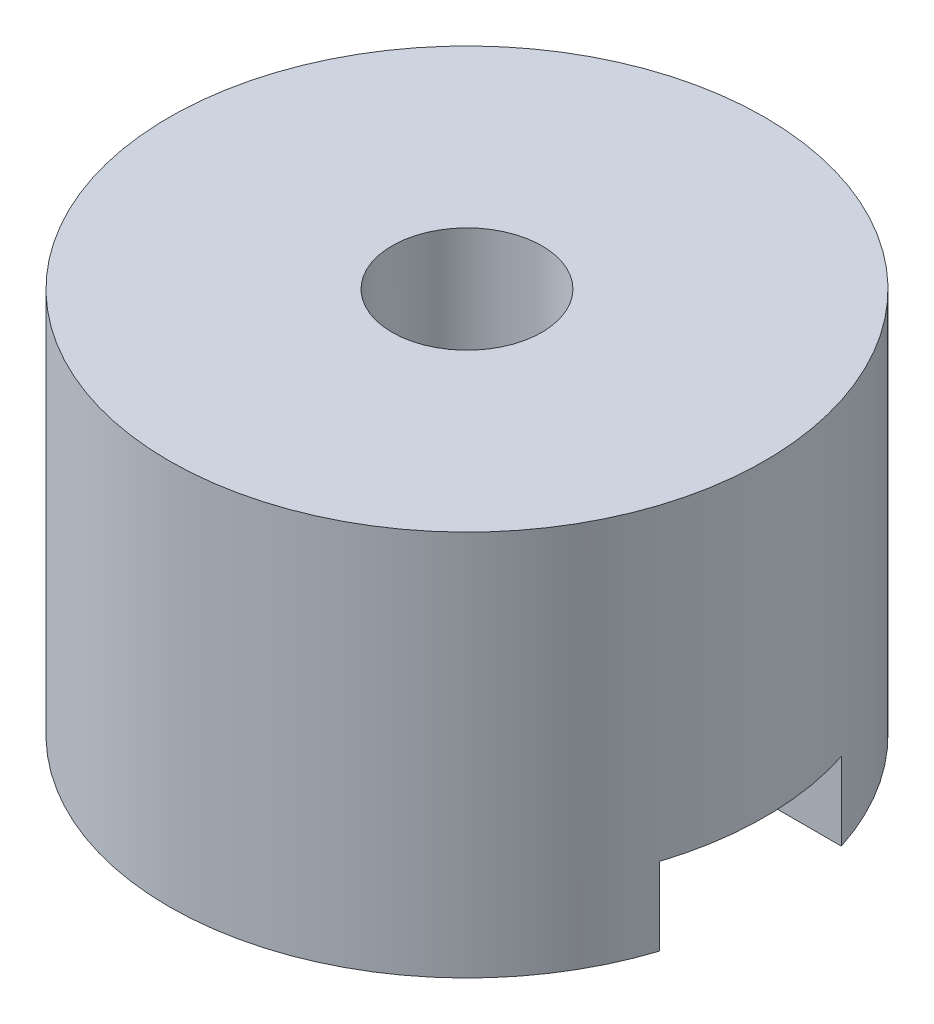
ISO-10303-21;
HEADER;
FILE_DESCRIPTION(('STEP AP214'),'2;1');
FILE_NAME('part.step','',(''),(''),'','','');
FILE_SCHEMA(('AUTOMOTIVE_DESIGN { 1 0 10303 214 1 1 1 1 }'));
ENDSEC;
DATA;
#1=APPLICATION_CONTEXT('core data for automotive mechanical design processes');
#2=APPLICATION_PROTOCOL_DEFINITION('international standard','automotive_design',2000,#1);
#3=PRODUCT_CONTEXT('',#1,'mechanical');
#4=PRODUCT('Part','Part','',(#3));
#5=PRODUCT_RELATED_PRODUCT_CATEGORY('part','',(#4));
#6=PRODUCT_DEFINITION_FORMATION('','',#4);
#7=PRODUCT_DEFINITION_CONTEXT('part definition',#1,'design');
#8=PRODUCT_DEFINITION('design','',#6,#7);
#9=PRODUCT_DEFINITION_SHAPE('','',#8);
#10=(LENGTH_UNIT() NAMED_UNIT(*) SI_UNIT(.MILLI.,.METRE.));
#11=(NAMED_UNIT(*) PLANE_ANGLE_UNIT() SI_UNIT($,.RADIAN.));
#12=(NAMED_UNIT(*) SI_UNIT($,.STERADIAN.) SOLID_ANGLE_UNIT());
#13=UNCERTAINTY_MEASURE_WITH_UNIT(LENGTH_MEASURE(1.E-05),#10,'distance_accuracy_value','');
#14=(GEOMETRIC_REPRESENTATION_CONTEXT(3) GLOBAL_UNCERTAINTY_ASSIGNED_CONTEXT((#13)) GLOBAL_UNIT_ASSIGNED_CONTEXT((#10,
#11,#12)) REPRESENTATION_CONTEXT('',''));
#15=CARTESIAN_POINT('',(0.,0.,0.));
#16=DIRECTION('',(0.,0.,1.));
#17=DIRECTION('',(1.,0.,0.));
#18=AXIS2_PLACEMENT_3D('',#15,#16,#17);
#19=CARTESIAN_POINT('',(499.364,0.,152.4));
#20=DIRECTION('',(0.,0.,1.));
#21=DIRECTION('',(1.,0.,0.));
#22=AXIS2_PLACEMENT_3D('',#19,#20,#21);
#23=PLANE('',#22);
#24=DIRECTION('',(1.,0.,0.));
#25=VECTOR('',#24,1.);
#26=CARTESIAN_POINT('',(0.,0.,152.4));
#27=LINE('',#26,#25);
#28=CARTESIAN_POINT('',(475.540371047506,0.,152.4));
#29=VERTEX_POINT('',#28);
#30=CARTESIAN_POINT('',(-76.2,0.,152.4));
#31=VERTEX_POINT('',#30);
#32=EDGE_CURVE('E68',#29,#31,#27,.F.);
#33=ORIENTED_EDGE('',*,*,#32,.T.);
#34=DIRECTION('',(0.,1.,0.));
#35=VECTOR('',#34,1.);
#36=CARTESIAN_POINT('',(-76.2,0.,152.4));
#37=LINE('',#36,#35);
#38=CARTESIAN_POINT('',(-76.2,130.302,152.4));
#39=VERTEX_POINT('',#38);
#40=EDGE_CURVE('E135',#31,#39,#37,.T.);
#41=ORIENTED_EDGE('',*,*,#40,.T.);
#42=DIRECTION('',(1.,0.,0.));
#43=VECTOR('',#42,1.);
#44=CARTESIAN_POINT('',(0.,130.302,152.4));
#45=LINE('',#44,#43);
#46=CARTESIAN_POINT('',(475.540371047506,130.302,152.4));
#47=VERTEX_POINT('',#46);
#48=EDGE_CURVE('E105',#47,#39,#45,.F.);
#49=ORIENTED_EDGE('',*,*,#48,.F.);
#50=DIRECTION('',(0.,1.,0.));
#51=VECTOR('',#50,1.);
#52=CARTESIAN_POINT('',(475.540371047506,0.,152.4));
#53=LINE('',#52,#51);
#54=EDGE_CURVE('E110',#29,#47,#53,.T.);
#55=ORIENTED_EDGE('',*,*,#54,.F.);
#56=EDGE_LOOP('',(#33,#41,#49,#55));
#57=FACE_BOUND('',#56,.T.);
#58=ADVANCED_FACE('F15',(#57),#23,.F.);
#59=CARTESIAN_POINT('',(-76.2,0.,152.4));
#60=DIRECTION('',(-1.,0.,0.));
#61=DIRECTION('',(0.,0.,1.));
#62=AXIS2_PLACEMENT_3D('',#59,#60,#61);
#63=PLANE('',#62);
#64=DIRECTION('',(0.,0.,-1.));
#65=VECTOR('',#64,1.);
#66=CARTESIAN_POINT('',(-76.2,130.302,0.));
#67=LINE('',#66,#65);
#68=CARTESIAN_POINT('',(-76.2,130.302,99.9998999999499));
#69=VERTEX_POINT('',#68);
#70=EDGE_CURVE('E97',#39,#69,#67,.T.);
#71=ORIENTED_EDGE('',*,*,#70,.F.);
#72=ORIENTED_EDGE('',*,*,#40,.F.);
#73=DIRECTION('',(0.,0.,1.));
#74=VECTOR('',#73,1.);
#75=CARTESIAN_POINT('',(-76.2,0.,0.));
#76=LINE('',#75,#74);
#77=CARTESIAN_POINT('',(-76.2,0.,99.9998999999499));
#78=VERTEX_POINT('',#77);
#79=EDGE_CURVE('E119',#31,#78,#76,.F.);
#80=ORIENTED_EDGE('',*,*,#79,.T.);
#81=DIRECTION('',(0.,1.,0.));
#82=VECTOR('',#81,1.);
#83=CARTESIAN_POINT('',(-76.2,0.,99.9998999999499));
#84=LINE('',#83,#82);
#85=EDGE_CURVE('E132',#78,#69,#84,.T.);
#86=ORIENTED_EDGE('',*,*,#85,.T.);
#87=EDGE_LOOP('',(#71,#72,#80,#86));
#88=FACE_BOUND('',#87,.T.);
#89=ADVANCED_FACE('F151',(#88),#63,.F.);
#90=CARTESIAN_POINT('',(0.,0.,0.));
#91=DIRECTION('',(0.,1.,0.));
#92=DIRECTION('',(0.,0.,1.));
#93=AXIS2_PLACEMENT_3D('',#90,#91,#92);
#94=CYLINDRICAL_SURFACE('',#93,125.723585694968);
#95=CARTESIAN_POINT('',(0.,647.7,0.));
#96=DIRECTION('',(0.,1.,0.));
#97=DIRECTION('',(0.,0.,1.));
#98=AXIS2_PLACEMENT_3D('',#95,#96,#97);
#99=CIRCLE('',#98,125.723585694968);
#100=CARTESIAN_POINT('',(0.,647.7,125.723585694968));
#101=VERTEX_POINT('',#100);
#102=EDGE_CURVE('E116',#101,#101,#99,.F.);
#103=ORIENTED_EDGE('',*,*,#102,.F.);
#104=EDGE_LOOP('',(#103));
#105=FACE_BOUND('',#104,.T.);
#106=ORIENTED_EDGE('',*,*,#85,.F.);
#107=CARTESIAN_POINT('',(0.,0.,0.));
#108=DIRECTION('',(0.,1.,0.));
#109=DIRECTION('',(0.,0.,1.));
#110=AXIS2_PLACEMENT_3D('',#107,#108,#109);
#111=CIRCLE('',#110,125.723585694968);
#112=CARTESIAN_POINT('',(-76.2,0.,-99.9998999999499));
#113=VERTEX_POINT('',#112);
#114=EDGE_CURVE('E18',#78,#113,#111,.F.);
#115=ORIENTED_EDGE('',*,*,#114,.T.);
#116=DIRECTION('',(0.,1.,0.));
#117=VECTOR('',#116,1.);
#118=CARTESIAN_POINT('',(-76.2,0.,-99.99989999995));
#119=LINE('',#118,#117);
#120=CARTESIAN_POINT('',(-76.2,130.302,-99.9998999999499));
#121=VERTEX_POINT('',#120);
#122=EDGE_CURVE('E84',#113,#121,#119,.T.);
#123=ORIENTED_EDGE('',*,*,#122,.T.);
#124=CARTESIAN_POINT('',(0.,130.302,0.));
#125=DIRECTION('',(0.,1.,0.));
#126=DIRECTION('',(0.,0.,1.));
#127=AXIS2_PLACEMENT_3D('',#124,#125,#126);
#128=CIRCLE('',#127,125.723585694968);
#129=EDGE_CURVE('E95',#69,#121,#128,.T.);
#130=ORIENTED_EDGE('',*,*,#129,.F.);
#131=EDGE_LOOP('',(#106,#115,#123,#130));
#132=FACE_BOUND('',#131,.T.);
#133=ADVANCED_FACE('F149',(#105,#132),#94,.F.);
#134=CARTESIAN_POINT('',(-76.2,0.,152.4));
#135=DIRECTION('',(-1.,0.,0.));
#136=DIRECTION('',(0.,0.,1.));
#137=AXIS2_PLACEMENT_3D('',#134,#135,#136);
#138=PLANE('',#137);
#139=DIRECTION('',(0.,0.,-1.));
#140=VECTOR('',#139,1.);
#141=CARTESIAN_POINT('',(-76.2,130.302,0.));
#142=LINE('',#141,#140);
#143=CARTESIAN_POINT('',(-76.2,130.302,-152.4));
#144=VERTEX_POINT('',#143);
#145=EDGE_CURVE('E81',#121,#144,#142,.T.);
#146=ORIENTED_EDGE('',*,*,#145,.F.);
#147=ORIENTED_EDGE('',*,*,#122,.F.);
#148=DIRECTION('',(0.,0.,1.));
#149=VECTOR('',#148,1.);
#150=CARTESIAN_POINT('',(-76.2,0.,0.));
#151=LINE('',#150,#149);
#152=CARTESIAN_POINT('',(-76.2,0.,-152.4));
#153=VERTEX_POINT('',#152);
#154=EDGE_CURVE('E83',#113,#153,#151,.F.);
#155=ORIENTED_EDGE('',*,*,#154,.T.);
#156=DIRECTION('',(0.,1.,0.));
#157=VECTOR('',#156,1.);
#158=CARTESIAN_POINT('',(-76.2,0.,-152.4));
#159=LINE('',#158,#157);
#160=EDGE_CURVE('E77',#153,#144,#159,.T.);
#161=ORIENTED_EDGE('',*,*,#160,.T.);
#162=EDGE_LOOP('',(#146,#147,#155,#161));
#163=FACE_BOUND('',#162,.T.);
#164=ADVANCED_FACE('F79',(#163),#138,.F.);
#165=CARTESIAN_POINT('',(0.,0.,-152.4));
#166=DIRECTION('',(0.,0.,-1.));
#167=DIRECTION('',(-1.,0.,0.));
#168=AXIS2_PLACEMENT_3D('',#165,#166,#167);
#169=PLANE('',#168);
#170=DIRECTION('',(1.,0.,0.));
#171=VECTOR('',#170,1.);
#172=CARTESIAN_POINT('',(0.,130.302,-152.4));
#173=LINE('',#172,#171);
#174=CARTESIAN_POINT('',(475.540371047506,130.302,-152.4));
#175=VERTEX_POINT('',#174);
#176=EDGE_CURVE('E87',#144,#175,#173,.T.);
#177=ORIENTED_EDGE('',*,*,#176,.F.);
#178=ORIENTED_EDGE('',*,*,#160,.F.);
#179=DIRECTION('',(1.,0.,0.));
#180=VECTOR('',#179,1.);
#181=CARTESIAN_POINT('',(0.,0.,-152.4));
#182=LINE('',#181,#180);
#183=CARTESIAN_POINT('',(475.540371047506,0.,-152.4));
#184=VERTEX_POINT('',#183);
#185=EDGE_CURVE('E33',#153,#184,#182,.T.);
#186=ORIENTED_EDGE('',*,*,#185,.T.);
#187=DIRECTION('',(0.,1.,0.));
#188=VECTOR('',#187,1.);
#189=CARTESIAN_POINT('',(475.540371047506,0.,-152.4));
#190=LINE('',#189,#188);
#191=EDGE_CURVE('E90',#175,#184,#190,.F.);
#192=ORIENTED_EDGE('',*,*,#191,.F.);
#193=EDGE_LOOP('',(#177,#178,#186,#192));
#194=FACE_BOUND('',#193,.T.);
#195=ADVANCED_FACE('F88',(#194),#169,.F.);
#196=CARTESIAN_POINT('',(0.,0.,0.));
#197=DIRECTION('',(0.,1.,0.));
#198=DIRECTION('',(0.,0.,1.));
#199=AXIS2_PLACEMENT_3D('',#196,#197,#198);
#200=PLANE('',#199);
#201=ORIENTED_EDGE('',*,*,#114,.F.);
#202=ORIENTED_EDGE('',*,*,#79,.F.);
#203=ORIENTED_EDGE('',*,*,#32,.F.);
#204=CARTESIAN_POINT('',(0.,0.,0.));
#205=DIRECTION('',(0.,1.,0.));
#206=DIRECTION('',(0.,0.,1.));
#207=AXIS2_PLACEMENT_3D('',#204,#205,#206);
#208=CIRCLE('',#207,499.364);
#209=EDGE_CURVE('E114',#184,#29,#208,.T.);
#210=ORIENTED_EDGE('',*,*,#209,.F.);
#211=ORIENTED_EDGE('',*,*,#185,.F.);
#212=ORIENTED_EDGE('',*,*,#154,.F.);
#213=EDGE_LOOP('',(#201,#202,#203,#210,#211,#212));
#214=FACE_BOUND('',#213,.T.);
#215=ADVANCED_FACE('F156',(#214),#200,.F.);
#216=CARTESIAN_POINT('',(0.,647.7,0.));
#217=DIRECTION('',(0.,1.,0.));
#218=DIRECTION('',(0.,0.,1.));
#219=AXIS2_PLACEMENT_3D('',#216,#217,#218);
#220=PLANE('',#219);
#221=ORIENTED_EDGE('',*,*,#102,.T.);
#222=EDGE_LOOP('',(#221));
#223=FACE_BOUND('',#222,.T.);
#224=CARTESIAN_POINT('',(0.,647.7,0.));
#225=DIRECTION('',(0.,1.,0.));
#226=DIRECTION('',(0.,0.,1.));
#227=AXIS2_PLACEMENT_3D('',#224,#225,#226);
#228=CIRCLE('',#227,499.364);
#229=CARTESIAN_POINT('',(0.,647.7,499.364));
#230=VERTEX_POINT('',#229);
#231=EDGE_CURVE('E24',#230,#230,#228,.F.);
#232=ORIENTED_EDGE('',*,*,#231,.F.);
#233=EDGE_LOOP('',(#232));
#234=FACE_BOUND('',#233,.T.);
#235=ADVANCED_FACE('F146',(#223,#234),#220,.T.);
#236=CARTESIAN_POINT('',(0.,130.302,0.));
#237=DIRECTION('',(0.,-1.,0.));
#238=DIRECTION('',(0.,0.,-1.));
#239=AXIS2_PLACEMENT_3D('',#236,#237,#238);
#240=PLANE('',#239);
#241=ORIENTED_EDGE('',*,*,#176,.T.);
#242=CARTESIAN_POINT('',(0.,130.302,0.));
#243=DIRECTION('',(0.,1.,0.));
#244=DIRECTION('',(0.,0.,1.));
#245=AXIS2_PLACEMENT_3D('',#242,#243,#244);
#246=CIRCLE('',#245,499.364);
#247=EDGE_CURVE('E10',#47,#175,#246,.T.);
#248=ORIENTED_EDGE('',*,*,#247,.F.);
#249=ORIENTED_EDGE('',*,*,#48,.T.);
#250=ORIENTED_EDGE('',*,*,#70,.T.);
#251=ORIENTED_EDGE('',*,*,#129,.T.);
#252=ORIENTED_EDGE('',*,*,#145,.T.);
#253=EDGE_LOOP('',(#241,#248,#249,#250,#251,#252));
#254=FACE_BOUND('',#253,.T.);
#255=ADVANCED_FACE('F93',(#254),#240,.T.);
#256=CARTESIAN_POINT('',(0.,0.,0.));
#257=DIRECTION('',(0.,1.,0.));
#258=DIRECTION('',(0.,0.,1.));
#259=AXIS2_PLACEMENT_3D('',#256,#257,#258);
#260=CYLINDRICAL_SURFACE('',#259,499.364);
#261=ORIENTED_EDGE('',*,*,#231,.T.);
#262=EDGE_LOOP('',(#261));
#263=FACE_BOUND('',#262,.T.);
#264=ORIENTED_EDGE('',*,*,#209,.T.);
#265=ORIENTED_EDGE('',*,*,#54,.T.);
#266=ORIENTED_EDGE('',*,*,#247,.T.);
#267=ORIENTED_EDGE('',*,*,#191,.T.);
#268=EDGE_LOOP('',(#264,#265,#266,#267));
#269=FACE_BOUND('',#268,.T.);
#270=ADVANCED_FACE('F158',(#263,#269),#260,.T.);
#271=CLOSED_SHELL('',(#58,#89,#133,#164,#195,#215,#235,#255,#270));
#272=MANIFOLD_SOLID_BREP('B1',#271);
#273=ADVANCED_BREP_SHAPE_REPRESENTATION('',(#18,#272),#14);
#274=SHAPE_DEFINITION_REPRESENTATION(#9,#273);
ENDSEC;
END-ISO-10303-21;
